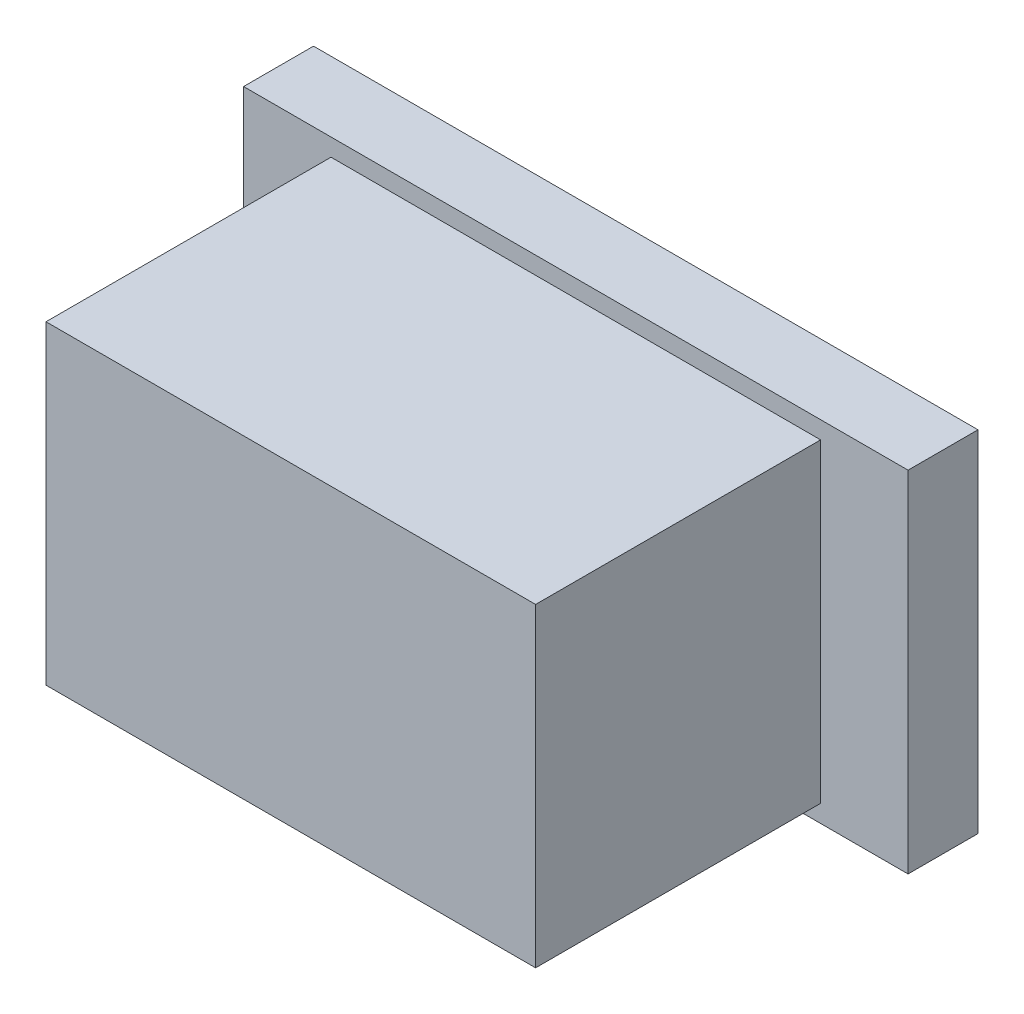
ISO-10303-21;
HEADER;
FILE_DESCRIPTION(('STEP AP214'),'2;1');
FILE_NAME('part.step','',(''),(''),'','','');
FILE_SCHEMA(('AUTOMOTIVE_DESIGN { 1 0 10303 214 1 1 1 1 }'));
ENDSEC;
DATA;
#1=APPLICATION_CONTEXT('core data for automotive mechanical design processes');
#2=APPLICATION_PROTOCOL_DEFINITION('international standard','automotive_design',2000,#1);
#3=PRODUCT_CONTEXT('',#1,'mechanical');
#4=PRODUCT('Part','Part','',(#3));
#5=PRODUCT_RELATED_PRODUCT_CATEGORY('part','',(#4));
#6=PRODUCT_DEFINITION_FORMATION('','',#4);
#7=PRODUCT_DEFINITION_CONTEXT('part definition',#1,'design');
#8=PRODUCT_DEFINITION('design','',#6,#7);
#9=PRODUCT_DEFINITION_SHAPE('','',#8);
#10=(LENGTH_UNIT() NAMED_UNIT(*) SI_UNIT(.MILLI.,.METRE.));
#11=(NAMED_UNIT(*) PLANE_ANGLE_UNIT() SI_UNIT($,.RADIAN.));
#12=(NAMED_UNIT(*) SI_UNIT($,.STERADIAN.) SOLID_ANGLE_UNIT());
#13=UNCERTAINTY_MEASURE_WITH_UNIT(LENGTH_MEASURE(1.E-05),#10,'distance_accuracy_value','');
#14=(GEOMETRIC_REPRESENTATION_CONTEXT(3) GLOBAL_UNCERTAINTY_ASSIGNED_CONTEXT((#13)) GLOBAL_UNIT_ASSIGNED_CONTEXT((#10,
#11,#12)) REPRESENTATION_CONTEXT('',''));
#15=CARTESIAN_POINT('',(0.,0.,0.));
#16=DIRECTION('',(0.,0.,1.));
#17=DIRECTION('',(1.,0.,0.));
#18=AXIS2_PLACEMENT_3D('',#15,#16,#17);
#19=CARTESIAN_POINT('',(0.,0.,0.8));
#20=DIRECTION('',(0.,0.,1.));
#21=DIRECTION('',(1.,0.,0.));
#22=AXIS2_PLACEMENT_3D('',#19,#20,#21);
#23=PLANE('',#22);
#24=DIRECTION('',(0.,-1.,0.));
#25=VECTOR('',#24,1.);
#26=CARTESIAN_POINT('',(-3.8,2.,0.8));
#27=LINE('',#26,#25);
#28=CARTESIAN_POINT('',(-3.8,2.,0.8));
#29=VERTEX_POINT('',#28);
#30=CARTESIAN_POINT('',(-3.8,-2.,0.8));
#31=VERTEX_POINT('',#30);
#32=EDGE_CURVE('E151',#29,#31,#27,.T.);
#33=ORIENTED_EDGE('',*,*,#32,.T.);
#34=DIRECTION('',(1.,0.,0.));
#35=VECTOR('',#34,1.);
#36=CARTESIAN_POINT('',(-3.8,-2.,0.8));
#37=LINE('',#36,#35);
#38=CARTESIAN_POINT('',(3.8,-2.,0.8));
#39=VERTEX_POINT('',#38);
#40=EDGE_CURVE('E91',#31,#39,#37,.T.);
#41=ORIENTED_EDGE('',*,*,#40,.T.);
#42=DIRECTION('',(0.,1.,0.));
#43=VECTOR('',#42,1.);
#44=CARTESIAN_POINT('',(3.8,-2.,0.8));
#45=LINE('',#44,#43);
#46=CARTESIAN_POINT('',(3.8,2.,0.8));
#47=VERTEX_POINT('',#46);
#48=EDGE_CURVE('E154',#39,#47,#45,.T.);
#49=ORIENTED_EDGE('',*,*,#48,.T.);
#50=DIRECTION('',(-1.,0.,0.));
#51=VECTOR('',#50,1.);
#52=CARTESIAN_POINT('',(3.8,2.,0.8));
#53=LINE('',#52,#51);
#54=EDGE_CURVE('E63',#47,#29,#53,.T.);
#55=ORIENTED_EDGE('',*,*,#54,.T.);
#56=EDGE_LOOP('',(#33,#41,#49,#55));
#57=FACE_BOUND('',#56,.T.);
#58=DIRECTION('',(-1.,0.,0.));
#59=VECTOR('',#58,1.);
#60=CARTESIAN_POINT('',(0.,-1.8,0.8));
#61=LINE('',#60,#59);
#62=CARTESIAN_POINT('',(2.8,-1.8,0.8));
#63=VERTEX_POINT('',#62);
#64=CARTESIAN_POINT('',(-2.8,-1.8,0.8));
#65=VERTEX_POINT('',#64);
#66=EDGE_CURVE('E147',#63,#65,#61,.T.);
#67=ORIENTED_EDGE('',*,*,#66,.T.);
#68=DIRECTION('',(0.,1.,0.));
#69=VECTOR('',#68,1.);
#70=CARTESIAN_POINT('',(-2.8,0.,0.8));
#71=LINE('',#70,#69);
#72=CARTESIAN_POINT('',(-2.8,1.8,0.8));
#73=VERTEX_POINT('',#72);
#74=EDGE_CURVE('E136',#65,#73,#71,.T.);
#75=ORIENTED_EDGE('',*,*,#74,.T.);
#76=DIRECTION('',(1.,0.,0.));
#77=VECTOR('',#76,1.);
#78=CARTESIAN_POINT('',(0.,1.8,0.8));
#79=LINE('',#78,#77);
#80=CARTESIAN_POINT('',(2.8,1.8,0.8));
#81=VERTEX_POINT('',#80);
#82=EDGE_CURVE('E137',#73,#81,#79,.T.);
#83=ORIENTED_EDGE('',*,*,#82,.T.);
#84=DIRECTION('',(0.,-1.,0.));
#85=VECTOR('',#84,1.);
#86=CARTESIAN_POINT('',(2.8,0.,0.8));
#87=LINE('',#86,#85);
#88=EDGE_CURVE('E140',#81,#63,#87,.T.);
#89=ORIENTED_EDGE('',*,*,#88,.T.);
#90=EDGE_LOOP('',(#67,#75,#83,#89));
#91=FACE_BOUND('',#90,.T.);
#92=ADVANCED_FACE('F39',(#57,#91),#23,.T.);
#93=CARTESIAN_POINT('',(-3.8,2.,0.8));
#94=DIRECTION('',(1.,0.,0.));
#95=DIRECTION('',(0.,0.,-1.));
#96=AXIS2_PLACEMENT_3D('',#93,#94,#95);
#97=PLANE('',#96);
#98=DIRECTION('',(0.,-1.,0.));
#99=VECTOR('',#98,1.);
#100=CARTESIAN_POINT('',(-3.8,2.,0.));
#101=LINE('',#100,#99);
#102=CARTESIAN_POINT('',(-3.8,2.,0.));
#103=VERTEX_POINT('',#102);
#104=CARTESIAN_POINT('',(-3.8,-2.,0.));
#105=VERTEX_POINT('',#104);
#106=EDGE_CURVE('E150',#103,#105,#101,.T.);
#107=ORIENTED_EDGE('',*,*,#106,.T.);
#108=DIRECTION('',(0.,0.,-1.));
#109=VECTOR('',#108,1.);
#110=CARTESIAN_POINT('',(-3.8,-2.,0.8));
#111=LINE('',#110,#109);
#112=EDGE_CURVE('E11',#31,#105,#111,.T.);
#113=ORIENTED_EDGE('',*,*,#112,.F.);
#114=ORIENTED_EDGE('',*,*,#32,.F.);
#115=DIRECTION('',(0.,0.,-1.));
#116=VECTOR('',#115,1.);
#117=CARTESIAN_POINT('',(-3.8,2.,0.8));
#118=LINE('',#117,#116);
#119=EDGE_CURVE('E157',#29,#103,#118,.T.);
#120=ORIENTED_EDGE('',*,*,#119,.T.);
#121=EDGE_LOOP('',(#107,#113,#114,#120));
#122=FACE_BOUND('',#121,.T.);
#123=ADVANCED_FACE('F41',(#122),#97,.F.);
#124=CARTESIAN_POINT('',(-3.8,-2.,0.8));
#125=DIRECTION('',(0.,1.,0.));
#126=DIRECTION('',(0.,0.,1.));
#127=AXIS2_PLACEMENT_3D('',#124,#125,#126);
#128=PLANE('',#127);
#129=DIRECTION('',(1.,0.,0.));
#130=VECTOR('',#129,1.);
#131=CARTESIAN_POINT('',(-3.8,-2.,0.));
#132=LINE('',#131,#130);
#133=CARTESIAN_POINT('',(3.8,-2.,0.));
#134=VERTEX_POINT('',#133);
#135=EDGE_CURVE('E160',#105,#134,#132,.T.);
#136=ORIENTED_EDGE('',*,*,#135,.T.);
#137=DIRECTION('',(0.,0.,-1.));
#138=VECTOR('',#137,1.);
#139=CARTESIAN_POINT('',(3.8,-2.,0.8));
#140=LINE('',#139,#138);
#141=EDGE_CURVE('E47',#39,#134,#140,.T.);
#142=ORIENTED_EDGE('',*,*,#141,.F.);
#143=ORIENTED_EDGE('',*,*,#40,.F.);
#144=ORIENTED_EDGE('',*,*,#112,.T.);
#145=EDGE_LOOP('',(#136,#142,#143,#144));
#146=FACE_BOUND('',#145,.T.);
#147=ADVANCED_FACE('F187',(#146),#128,.F.);
#148=CARTESIAN_POINT('',(3.8,-2.,0.8));
#149=DIRECTION('',(-1.,0.,0.));
#150=DIRECTION('',(0.,0.,1.));
#151=AXIS2_PLACEMENT_3D('',#148,#149,#150);
#152=PLANE('',#151);
#153=DIRECTION('',(0.,1.,0.));
#154=VECTOR('',#153,1.);
#155=CARTESIAN_POINT('',(3.8,-2.,0.));
#156=LINE('',#155,#154);
#157=CARTESIAN_POINT('',(3.8,2.,0.));
#158=VERTEX_POINT('',#157);
#159=EDGE_CURVE('E162',#134,#158,#156,.T.);
#160=ORIENTED_EDGE('',*,*,#159,.T.);
#161=DIRECTION('',(0.,0.,-1.));
#162=VECTOR('',#161,1.);
#163=CARTESIAN_POINT('',(3.8,2.,0.8));
#164=LINE('',#163,#162);
#165=EDGE_CURVE('E166',#47,#158,#164,.T.);
#166=ORIENTED_EDGE('',*,*,#165,.F.);
#167=ORIENTED_EDGE('',*,*,#48,.F.);
#168=ORIENTED_EDGE('',*,*,#141,.T.);
#169=EDGE_LOOP('',(#160,#166,#167,#168));
#170=FACE_BOUND('',#169,.T.);
#171=ADVANCED_FACE('F171',(#170),#152,.F.);
#172=CARTESIAN_POINT('',(3.8,2.,0.8));
#173=DIRECTION('',(0.,-1.,0.));
#174=DIRECTION('',(0.,0.,-1.));
#175=AXIS2_PLACEMENT_3D('',#172,#173,#174);
#176=PLANE('',#175);
#177=DIRECTION('',(-1.,0.,0.));
#178=VECTOR('',#177,1.);
#179=CARTESIAN_POINT('',(3.8,2.,0.));
#180=LINE('',#179,#178);
#181=EDGE_CURVE('E84',#158,#103,#180,.T.);
#182=ORIENTED_EDGE('',*,*,#181,.T.);
#183=ORIENTED_EDGE('',*,*,#119,.F.);
#184=ORIENTED_EDGE('',*,*,#54,.F.);
#185=ORIENTED_EDGE('',*,*,#165,.T.);
#186=EDGE_LOOP('',(#182,#183,#184,#185));
#187=FACE_BOUND('',#186,.T.);
#188=ADVANCED_FACE('F179',(#187),#176,.F.);
#189=CARTESIAN_POINT('',(0.,0.,0.));
#190=DIRECTION('',(0.,0.,1.));
#191=DIRECTION('',(1.,0.,0.));
#192=AXIS2_PLACEMENT_3D('',#189,#190,#191);
#193=PLANE('',#192);
#194=ORIENTED_EDGE('',*,*,#106,.F.);
#195=ORIENTED_EDGE('',*,*,#181,.F.);
#196=ORIENTED_EDGE('',*,*,#159,.F.);
#197=ORIENTED_EDGE('',*,*,#135,.F.);
#198=EDGE_LOOP('',(#194,#195,#196,#197));
#199=FACE_BOUND('',#198,.T.);
#200=ADVANCED_FACE('F175',(#199),#193,.F.);
#201=CARTESIAN_POINT('',(-2.8,1.8,4.06));
#202=DIRECTION('',(1.,0.,0.));
#203=DIRECTION('',(0.,0.,-1.));
#204=AXIS2_PLACEMENT_3D('',#201,#202,#203);
#205=PLANE('',#204);
#206=ORIENTED_EDGE('',*,*,#74,.F.);
#207=DIRECTION('',(0.,0.,-1.));
#208=VECTOR('',#207,1.);
#209=CARTESIAN_POINT('',(-2.8,-1.8,4.06));
#210=LINE('',#209,#208);
#211=CARTESIAN_POINT('',(-2.8,-1.8,4.06));
#212=VERTEX_POINT('',#211);
#213=EDGE_CURVE('E118',#212,#65,#210,.T.);
#214=ORIENTED_EDGE('',*,*,#213,.F.);
#215=DIRECTION('',(0.,-1.,0.));
#216=VECTOR('',#215,1.);
#217=CARTESIAN_POINT('',(-2.8,1.8,4.06));
#218=LINE('',#217,#216);
#219=CARTESIAN_POINT('',(-2.8,1.8,4.06));
#220=VERTEX_POINT('',#219);
#221=EDGE_CURVE('E125',#220,#212,#218,.T.);
#222=ORIENTED_EDGE('',*,*,#221,.F.);
#223=DIRECTION('',(0.,0.,-1.));
#224=VECTOR('',#223,1.);
#225=CARTESIAN_POINT('',(-2.8,1.8,4.06));
#226=LINE('',#225,#224);
#227=EDGE_CURVE('E293',#220,#73,#226,.T.);
#228=ORIENTED_EDGE('',*,*,#227,.T.);
#229=EDGE_LOOP('',(#206,#214,#222,#228));
#230=FACE_BOUND('',#229,.T.);
#231=ADVANCED_FACE('F134',(#230),#205,.F.);
#232=CARTESIAN_POINT('',(-2.8,-1.8,4.06));
#233=DIRECTION('',(0.,1.,0.));
#234=DIRECTION('',(0.,0.,1.));
#235=AXIS2_PLACEMENT_3D('',#232,#233,#234);
#236=PLANE('',#235);
#237=ORIENTED_EDGE('',*,*,#66,.F.);
#238=DIRECTION('',(0.,0.,-1.));
#239=VECTOR('',#238,1.);
#240=CARTESIAN_POINT('',(2.8,-1.8,4.06));
#241=LINE('',#240,#239);
#242=CARTESIAN_POINT('',(2.8,-1.8,4.06));
#243=VERTEX_POINT('',#242);
#244=EDGE_CURVE('E121',#243,#63,#241,.T.);
#245=ORIENTED_EDGE('',*,*,#244,.F.);
#246=DIRECTION('',(1.,0.,0.));
#247=VECTOR('',#246,1.);
#248=CARTESIAN_POINT('',(-2.8,-1.8,4.06));
#249=LINE('',#248,#247);
#250=EDGE_CURVE('E114',#212,#243,#249,.T.);
#251=ORIENTED_EDGE('',*,*,#250,.F.);
#252=ORIENTED_EDGE('',*,*,#213,.T.);
#253=EDGE_LOOP('',(#237,#245,#251,#252));
#254=FACE_BOUND('',#253,.T.);
#255=ADVANCED_FACE('F116',(#254),#236,.F.);
#256=CARTESIAN_POINT('',(2.8,-1.8,4.06));
#257=DIRECTION('',(-1.,0.,0.));
#258=DIRECTION('',(0.,0.,1.));
#259=AXIS2_PLACEMENT_3D('',#256,#257,#258);
#260=PLANE('',#259);
#261=ORIENTED_EDGE('',*,*,#88,.F.);
#262=DIRECTION('',(0.,0.,-1.));
#263=VECTOR('',#262,1.);
#264=CARTESIAN_POINT('',(2.8,1.8,4.06));
#265=LINE('',#264,#263);
#266=CARTESIAN_POINT('',(2.8,1.8,4.06));
#267=VERTEX_POINT('',#266);
#268=EDGE_CURVE('E54',#267,#81,#265,.T.);
#269=ORIENTED_EDGE('',*,*,#268,.F.);
#270=DIRECTION('',(0.,1.,0.));
#271=VECTOR('',#270,1.);
#272=CARTESIAN_POINT('',(2.8,-1.8,4.06));
#273=LINE('',#272,#271);
#274=EDGE_CURVE('E124',#243,#267,#273,.T.);
#275=ORIENTED_EDGE('',*,*,#274,.F.);
#276=ORIENTED_EDGE('',*,*,#244,.T.);
#277=EDGE_LOOP('',(#261,#269,#275,#276));
#278=FACE_BOUND('',#277,.T.);
#279=ADVANCED_FACE('F200',(#278),#260,.F.);
#280=CARTESIAN_POINT('',(2.8,1.8,4.06));
#281=DIRECTION('',(0.,-1.,0.));
#282=DIRECTION('',(0.,0.,-1.));
#283=AXIS2_PLACEMENT_3D('',#280,#281,#282);
#284=PLANE('',#283);
#285=ORIENTED_EDGE('',*,*,#82,.F.);
#286=ORIENTED_EDGE('',*,*,#227,.F.);
#287=DIRECTION('',(-1.,0.,0.));
#288=VECTOR('',#287,1.);
#289=CARTESIAN_POINT('',(2.8,1.8,4.06));
#290=LINE('',#289,#288);
#291=EDGE_CURVE('E129',#267,#220,#290,.T.);
#292=ORIENTED_EDGE('',*,*,#291,.F.);
#293=ORIENTED_EDGE('',*,*,#268,.T.);
#294=EDGE_LOOP('',(#285,#286,#292,#293));
#295=FACE_BOUND('',#294,.T.);
#296=ADVANCED_FACE('F203',(#295),#284,.F.);
#297=CARTESIAN_POINT('',(0.,0.,4.06));
#298=DIRECTION('',(0.,0.,1.));
#299=DIRECTION('',(1.,0.,0.));
#300=AXIS2_PLACEMENT_3D('',#297,#298,#299);
#301=PLANE('',#300);
#302=ORIENTED_EDGE('',*,*,#221,.T.);
#303=ORIENTED_EDGE('',*,*,#250,.T.);
#304=ORIENTED_EDGE('',*,*,#274,.T.);
#305=ORIENTED_EDGE('',*,*,#291,.T.);
#306=EDGE_LOOP('',(#302,#303,#304,#305));
#307=FACE_BOUND('',#306,.T.);
#308=ADVANCED_FACE('F128',(#307),#301,.T.);
#309=CLOSED_SHELL('',(#92,#123,#147,#171,#188,#200,#231,#255,#279,#296,#308));
#310=MANIFOLD_SOLID_BREP('B2',#309);
#311=ADVANCED_BREP_SHAPE_REPRESENTATION('',(#18,#310),#14);
#312=SHAPE_DEFINITION_REPRESENTATION(#9,#311);
ENDSEC;
END-ISO-10303-21;
